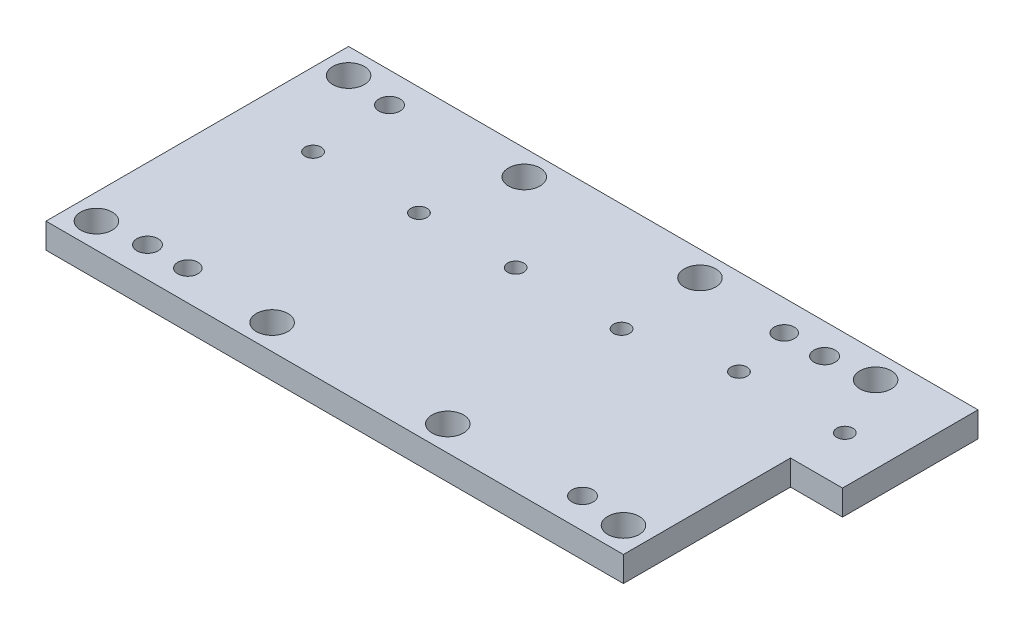
ISO-10303-21;
HEADER;
FILE_DESCRIPTION(('STEP AP214'),'2;1');
FILE_NAME('part.step','',(''),(''),'','','');
FILE_SCHEMA(('AUTOMOTIVE_DESIGN { 1 0 10303 214 1 1 1 1 }'));
ENDSEC;
DATA;
#1=APPLICATION_CONTEXT('core data for automotive mechanical design processes');
#2=APPLICATION_PROTOCOL_DEFINITION('international standard','automotive_design',2000,#1);
#3=PRODUCT_CONTEXT('',#1,'mechanical');
#4=PRODUCT('Part','Part','',(#3));
#5=PRODUCT_RELATED_PRODUCT_CATEGORY('part','',(#4));
#6=PRODUCT_DEFINITION_FORMATION('','',#4);
#7=PRODUCT_DEFINITION_CONTEXT('part definition',#1,'design');
#8=PRODUCT_DEFINITION('design','',#6,#7);
#9=PRODUCT_DEFINITION_SHAPE('','',#8);
#10=(LENGTH_UNIT() NAMED_UNIT(*) SI_UNIT(.MILLI.,.METRE.));
#11=(NAMED_UNIT(*) PLANE_ANGLE_UNIT() SI_UNIT($,.RADIAN.));
#12=(NAMED_UNIT(*) SI_UNIT($,.STERADIAN.) SOLID_ANGLE_UNIT());
#13=UNCERTAINTY_MEASURE_WITH_UNIT(LENGTH_MEASURE(1.E-05),#10,'distance_accuracy_value','');
#14=(GEOMETRIC_REPRESENTATION_CONTEXT(3) GLOBAL_UNCERTAINTY_ASSIGNED_CONTEXT((#13)) GLOBAL_UNIT_ASSIGNED_CONTEXT((#10,
#11,#12)) REPRESENTATION_CONTEXT('',''));
#15=CARTESIAN_POINT('',(0.,0.,0.));
#16=DIRECTION('',(0.,0.,1.));
#17=DIRECTION('',(1.,0.,0.));
#18=AXIS2_PLACEMENT_3D('',#15,#16,#17);
#19=CARTESIAN_POINT('',(0.,-10.,60.));
#20=DIRECTION('',(1.,0.,0.));
#21=DIRECTION('',(0.,0.,-1.));
#22=AXIS2_PLACEMENT_3D('',#19,#20,#21);
#23=PLANE('',#22);
#24=DIRECTION('',(0.,0.,-1.));
#25=VECTOR('',#24,1.);
#26=CARTESIAN_POINT('',(0.,-10.,60.));
#27=LINE('',#26,#25);
#28=CARTESIAN_POINT('',(0.,-10.,60.));
#29=VERTEX_POINT('',#28);
#30=CARTESIAN_POINT('',(0.,-10.,-6.2699959967968));
#31=VERTEX_POINT('',#30);
#32=EDGE_CURVE('E126',#29,#31,#27,.T.);
#33=ORIENTED_EDGE('',*,*,#32,.T.);
#34=DIRECTION('',(0.,1.,0.));
#35=VECTOR('',#34,1.);
#36=CARTESIAN_POINT('',(0.,-67.5553082723772,-6.2699959967968));
#37=LINE('',#36,#35);
#38=CARTESIAN_POINT('',(0.,0.,-6.2699959967968));
#39=VERTEX_POINT('',#38);
#40=EDGE_CURVE('E118',#31,#39,#37,.T.);
#41=ORIENTED_EDGE('',*,*,#40,.T.);
#42=DIRECTION('',(0.,0.,-1.));
#43=VECTOR('',#42,1.);
#44=CARTESIAN_POINT('',(0.,0.,60.));
#45=LINE('',#44,#43);
#46=CARTESIAN_POINT('',(0.,0.,60.));
#47=VERTEX_POINT('',#46);
#48=EDGE_CURVE('E125',#47,#39,#45,.T.);
#49=ORIENTED_EDGE('',*,*,#48,.F.);
#50=DIRECTION('',(0.,1.,0.));
#51=VECTOR('',#50,1.);
#52=CARTESIAN_POINT('',(0.,-10.,60.));
#53=LINE('',#52,#51);
#54=EDGE_CURVE('E11',#29,#47,#53,.T.);
#55=ORIENTED_EDGE('',*,*,#54,.F.);
#56=EDGE_LOOP('',(#33,#41,#49,#55));
#57=FACE_BOUND('',#56,.T.);
#58=ADVANCED_FACE('F39',(#57),#23,.T.);
#59=CARTESIAN_POINT('',(-229.,-10.,60.));
#60=DIRECTION('',(0.,0.,1.));
#61=DIRECTION('',(1.,0.,0.));
#62=AXIS2_PLACEMENT_3D('',#59,#60,#61);
#63=PLANE('',#62);
#64=DIRECTION('',(1.,0.,0.));
#65=VECTOR('',#64,1.);
#66=CARTESIAN_POINT('',(-229.,0.,60.));
#67=LINE('',#66,#65);
#68=CARTESIAN_POINT('',(-229.,0.,60.));
#69=VERTEX_POINT('',#68);
#70=EDGE_CURVE('E128',#69,#47,#67,.T.);
#71=ORIENTED_EDGE('',*,*,#70,.F.);
#72=DIRECTION('',(0.,1.,0.));
#73=VECTOR('',#72,1.);
#74=CARTESIAN_POINT('',(-229.,-10.,60.));
#75=LINE('',#74,#73);
#76=CARTESIAN_POINT('',(-229.,-10.,60.));
#77=VERTEX_POINT('',#76);
#78=EDGE_CURVE('E47',#77,#69,#75,.T.);
#79=ORIENTED_EDGE('',*,*,#78,.F.);
#80=DIRECTION('',(1.,0.,0.));
#81=VECTOR('',#80,1.);
#82=CARTESIAN_POINT('',(-229.,-10.,60.));
#83=LINE('',#82,#81);
#84=EDGE_CURVE('E132',#77,#29,#83,.T.);
#85=ORIENTED_EDGE('',*,*,#84,.T.);
#86=ORIENTED_EDGE('',*,*,#54,.T.);
#87=EDGE_LOOP('',(#71,#79,#85,#86));
#88=FACE_BOUND('',#87,.T.);
#89=ADVANCED_FACE('F329',(#88),#63,.T.);
#90=CARTESIAN_POINT('',(-229.,-10.,60.));
#91=DIRECTION('',(-1.,0.,0.));
#92=DIRECTION('',(0.,0.,1.));
#93=AXIS2_PLACEMENT_3D('',#90,#91,#92);
#94=PLANE('',#93);
#95=DIRECTION('',(0.,0.,1.));
#96=VECTOR('',#95,1.);
#97=CARTESIAN_POINT('',(-229.,0.,60.));
#98=LINE('',#97,#96);
#99=CARTESIAN_POINT('',(-229.,0.,-59.9999999999999));
#100=VERTEX_POINT('',#99);
#101=EDGE_CURVE('E139',#100,#69,#98,.T.);
#102=ORIENTED_EDGE('',*,*,#101,.F.);
#103=DIRECTION('',(0.,1.,0.));
#104=VECTOR('',#103,1.);
#105=CARTESIAN_POINT('',(-229.,-10.,-59.9999999999999));
#106=LINE('',#105,#104);
#107=CARTESIAN_POINT('',(-229.,-10.,-59.9999999999999));
#108=VERTEX_POINT('',#107);
#109=EDGE_CURVE('E42',#108,#100,#106,.T.);
#110=ORIENTED_EDGE('',*,*,#109,.F.);
#111=DIRECTION('',(0.,0.,1.));
#112=VECTOR('',#111,1.);
#113=CARTESIAN_POINT('',(-229.,-10.,60.));
#114=LINE('',#113,#112);
#115=EDGE_CURVE('E130',#108,#77,#114,.T.);
#116=ORIENTED_EDGE('',*,*,#115,.T.);
#117=ORIENTED_EDGE('',*,*,#78,.T.);
#118=EDGE_LOOP('',(#102,#110,#116,#117));
#119=FACE_BOUND('',#118,.T.);
#120=ADVANCED_FACE('F145',(#119),#94,.T.);
#121=CARTESIAN_POINT('',(-229.,-10.,-59.9999999999999));
#122=DIRECTION('',(0.,0.,-1.));
#123=DIRECTION('',(-1.,0.,0.));
#124=AXIS2_PLACEMENT_3D('',#121,#122,#123);
#125=PLANE('',#124);
#126=DIRECTION('',(-1.,0.,0.));
#127=VECTOR('',#126,1.);
#128=CARTESIAN_POINT('',(-229.,0.,-59.9999999999999));
#129=LINE('',#128,#127);
#130=CARTESIAN_POINT('',(20.6325030024023,0.,-60.));
#131=VERTEX_POINT('',#130);
#132=EDGE_CURVE('E136',#131,#100,#129,.T.);
#133=ORIENTED_EDGE('',*,*,#132,.F.);
#134=DIRECTION('',(0.,1.,0.));
#135=VECTOR('',#134,1.);
#136=CARTESIAN_POINT('',(20.6325030024023,-67.5553082723772,-60.));
#137=LINE('',#136,#135);
#138=CARTESIAN_POINT('',(20.6325030024023,-10.,-60.));
#139=VERTEX_POINT('',#138);
#140=EDGE_CURVE('E109',#139,#131,#137,.T.);
#141=ORIENTED_EDGE('',*,*,#140,.F.);
#142=DIRECTION('',(-1.,0.,0.));
#143=VECTOR('',#142,1.);
#144=CARTESIAN_POINT('',(-229.,-10.,-59.9999999999999));
#145=LINE('',#144,#143);
#146=EDGE_CURVE('E105',#139,#108,#145,.T.);
#147=ORIENTED_EDGE('',*,*,#146,.T.);
#148=ORIENTED_EDGE('',*,*,#109,.T.);
#149=EDGE_LOOP('',(#133,#141,#147,#148));
#150=FACE_BOUND('',#149,.T.);
#151=ADVANCED_FACE('F144',(#150),#125,.T.);
#152=CARTESIAN_POINT('',(0.,-10.,0.));
#153=DIRECTION('',(0.,-1.,0.));
#154=DIRECTION('',(0.,0.,-1.));
#155=AXIS2_PLACEMENT_3D('',#152,#153,#154);
#156=PLANE('',#155);
#157=CARTESIAN_POINT('',(-28.219,-10.,-48.));
#158=DIRECTION('',(0.,-1.,0.));
#159=DIRECTION('',(0.,0.,-1.));
#160=AXIS2_PLACEMENT_3D('',#157,#158,#159);
#161=CIRCLE('',#160,4.2);
#162=CARTESIAN_POINT('',(-28.219,-10.,-52.2));
#163=VERTEX_POINT('',#162);
#164=EDGE_CURVE('E268',#163,#163,#161,.T.);
#165=ORIENTED_EDGE('',*,*,#164,.F.);
#166=EDGE_LOOP('',(#165));
#167=FACE_BOUND('',#166,.T.);
#168=CARTESIAN_POINT('',(-200.75,-10.,-48.));
#169=DIRECTION('',(0.,-1.,0.));
#170=DIRECTION('',(0.,0.,-1.));
#171=AXIS2_PLACEMENT_3D('',#168,#169,#170);
#172=CIRCLE('',#171,4.20000000000001);
#173=CARTESIAN_POINT('',(-200.75,-10.,-52.2));
#174=VERTEX_POINT('',#173);
#175=EDGE_CURVE('E262',#174,#174,#172,.T.);
#176=ORIENTED_EDGE('',*,*,#175,.F.);
#177=EDGE_LOOP('',(#176));
#178=FACE_BOUND('',#177,.T.);
#179=CARTESIAN_POINT('',(-200.75,-10.,48.));
#180=DIRECTION('',(0.,-1.,0.));
#181=DIRECTION('',(0.,0.,-1.));
#182=AXIS2_PLACEMENT_3D('',#179,#180,#181);
#183=CIRCLE('',#182,4.20000000000001);
#184=CARTESIAN_POINT('',(-200.75,-10.,43.8));
#185=VERTEX_POINT('',#184);
#186=EDGE_CURVE('E256',#185,#185,#183,.T.);
#187=ORIENTED_EDGE('',*,*,#186,.F.);
#188=EDGE_LOOP('',(#187));
#189=FACE_BOUND('',#188,.T.);
#190=CARTESIAN_POINT('',(-28.219,-10.,48.));
#191=DIRECTION('',(0.,-1.,0.));
#192=DIRECTION('',(0.,0.,-1.));
#193=AXIS2_PLACEMENT_3D('',#190,#191,#192);
#194=CIRCLE('',#193,4.2);
#195=CARTESIAN_POINT('',(-28.219,-10.,43.8));
#196=VERTEX_POINT('',#195);
#197=EDGE_CURVE('E250',#196,#196,#194,.T.);
#198=ORIENTED_EDGE('',*,*,#197,.F.);
#199=EDGE_LOOP('',(#198));
#200=FACE_BOUND('',#199,.T.);
#201=CARTESIAN_POINT('',(-184.75,-10.,48.));
#202=DIRECTION('',(0.,-1.,0.));
#203=DIRECTION('',(0.,0.,-1.));
#204=AXIS2_PLACEMENT_3D('',#201,#202,#203);
#205=CIRCLE('',#204,3.99999999999998);
#206=CARTESIAN_POINT('',(-184.75,-10.,44.));
#207=VERTEX_POINT('',#206);
#208=EDGE_CURVE('E244',#207,#207,#205,.T.);
#209=ORIENTED_EDGE('',*,*,#208,.F.);
#210=EDGE_LOOP('',(#209));
#211=FACE_BOUND('',#210,.T.);
#212=CARTESIAN_POINT('',(-44.219,-10.,-48.));
#213=DIRECTION('',(0.,-1.,0.));
#214=DIRECTION('',(0.,0.,-1.));
#215=AXIS2_PLACEMENT_3D('',#212,#213,#214);
#216=CIRCLE('',#215,3.99999999999999);
#217=CARTESIAN_POINT('',(-44.219,-10.,-52.));
#218=VERTEX_POINT('',#217);
#219=EDGE_CURVE('E238',#218,#218,#216,.T.);
#220=ORIENTED_EDGE('',*,*,#219,.F.);
#221=EDGE_LOOP('',(#220));
#222=FACE_BOUND('',#221,.T.);
#223=CARTESIAN_POINT('',(2.12500000000002,-10.,-25.6910003850377));
#224=DIRECTION('',(0.,-1.,0.));
#225=DIRECTION('',(0.,0.,-1.));
#226=AXIS2_PLACEMENT_3D('',#223,#224,#225);
#227=CIRCLE('',#226,3.2);
#228=CARTESIAN_POINT('',(2.12500000000002,-10.,-28.8910003850377));
#229=VERTEX_POINT('',#228);
#230=EDGE_CURVE('E232',#229,#229,#227,.T.);
#231=ORIENTED_EDGE('',*,*,#230,.F.);
#232=EDGE_LOOP('',(#231));
#233=FACE_BOUND('',#232,.T.);
#234=CARTESIAN_POINT('',(-39.875,-10.,-25.6910003850377));
#235=DIRECTION('',(0.,-1.,0.));
#236=DIRECTION('',(0.,0.,-1.));
#237=AXIS2_PLACEMENT_3D('',#234,#235,#236);
#238=CIRCLE('',#237,3.2);
#239=CARTESIAN_POINT('',(-39.875,-10.,-28.8910003850377));
#240=VERTEX_POINT('',#239);
#241=EDGE_CURVE('E226',#240,#240,#238,.T.);
#242=ORIENTED_EDGE('',*,*,#241,.F.);
#243=EDGE_LOOP('',(#242));
#244=FACE_BOUND('',#243,.T.);
#245=CARTESIAN_POINT('',(-77.875,-10.,-17.1523660830142));
#246=DIRECTION('',(0.,-1.,0.));
#247=DIRECTION('',(0.,0.,-1.));
#248=AXIS2_PLACEMENT_3D('',#245,#246,#247);
#249=CIRCLE('',#248,3.19999999999999);
#250=CARTESIAN_POINT('',(-77.875,-10.,-20.3523660830141));
#251=VERTEX_POINT('',#250);
#252=EDGE_CURVE('E220',#251,#251,#249,.T.);
#253=ORIENTED_EDGE('',*,*,#252,.F.);
#254=EDGE_LOOP('',(#253));
#255=FACE_BOUND('',#254,.T.);
#256=CARTESIAN_POINT('',(-119.875,-10.,-17.1523660830142));
#257=DIRECTION('',(0.,-1.,0.));
#258=DIRECTION('',(0.,0.,-1.));
#259=AXIS2_PLACEMENT_3D('',#256,#257,#258);
#260=CIRCLE('',#259,3.19999999999999);
#261=CARTESIAN_POINT('',(-119.875,-10.,-20.3523660830142));
#262=VERTEX_POINT('',#261);
#263=EDGE_CURVE('E214',#262,#262,#260,.T.);
#264=ORIENTED_EDGE('',*,*,#263,.F.);
#265=EDGE_LOOP('',(#264));
#266=FACE_BOUND('',#265,.T.);
#267=CARTESIAN_POINT('',(-157.875,-10.,-16.78));
#268=DIRECTION('',(0.,-1.,0.));
#269=DIRECTION('',(0.,0.,-1.));
#270=AXIS2_PLACEMENT_3D('',#267,#268,#269);
#271=CIRCLE('',#270,3.20000000000001);
#272=CARTESIAN_POINT('',(-157.875,-10.,-19.98));
#273=VERTEX_POINT('',#272);
#274=EDGE_CURVE('E208',#273,#273,#271,.T.);
#275=ORIENTED_EDGE('',*,*,#274,.F.);
#276=EDGE_LOOP('',(#275));
#277=FACE_BOUND('',#276,.T.);
#278=CARTESIAN_POINT('',(-199.875,-10.,-16.78));
#279=DIRECTION('',(0.,-1.,0.));
#280=DIRECTION('',(0.,0.,-1.));
#281=AXIS2_PLACEMENT_3D('',#278,#279,#280);
#282=CIRCLE('',#281,3.20000000000001);
#283=CARTESIAN_POINT('',(-199.875,-10.,-19.98));
#284=VERTEX_POINT('',#283);
#285=EDGE_CURVE('E202',#284,#284,#282,.T.);
#286=ORIENTED_EDGE('',*,*,#285,.F.);
#287=EDGE_LOOP('',(#286));
#288=FACE_BOUND('',#287,.T.);
#289=CARTESIAN_POINT('',(-9.96899999999998,-10.,-50.));
#290=DIRECTION('',(0.,-1.,0.));
#291=DIRECTION('',(0.,0.,-1.));
#292=AXIS2_PLACEMENT_3D('',#289,#290,#291);
#293=CIRCLE('',#292,6.25);
#294=CARTESIAN_POINT('',(-9.96899999999998,-10.,-56.25));
#295=VERTEX_POINT('',#294);
#296=EDGE_CURVE('E196',#295,#295,#293,.T.);
#297=ORIENTED_EDGE('',*,*,#296,.F.);
#298=EDGE_LOOP('',(#297));
#299=FACE_BOUND('',#298,.T.);
#300=CARTESIAN_POINT('',(-79.8120139250372,-10.,-50.1837686791181));
#301=DIRECTION('',(0.,-1.,0.));
#302=DIRECTION('',(0.,0.,-1.));
#303=AXIS2_PLACEMENT_3D('',#300,#301,#302);
#304=CIRCLE('',#303,6.24999999999999);
#305=CARTESIAN_POINT('',(-79.8120139250372,-10.,-56.4337686791181));
#306=VERTEX_POINT('',#305);
#307=EDGE_CURVE('E190',#306,#306,#304,.T.);
#308=ORIENTED_EDGE('',*,*,#307,.F.);
#309=EDGE_LOOP('',(#308));
#310=FACE_BOUND('',#309,.T.);
#311=CARTESIAN_POINT('',(-149.323,-10.,-50.));
#312=DIRECTION('',(0.,-1.,0.));
#313=DIRECTION('',(0.,0.,-1.));
#314=AXIS2_PLACEMENT_3D('',#311,#312,#313);
#315=CIRCLE('',#314,6.25000000000001);
#316=CARTESIAN_POINT('',(-149.323,-10.,-56.25));
#317=VERTEX_POINT('',#316);
#318=EDGE_CURVE('E184',#317,#317,#315,.T.);
#319=ORIENTED_EDGE('',*,*,#318,.F.);
#320=EDGE_LOOP('',(#319));
#321=FACE_BOUND('',#320,.T.);
#322=CARTESIAN_POINT('',(-219.,-10.,-50.));
#323=DIRECTION('',(0.,-1.,0.));
#324=DIRECTION('',(0.,0.,-1.));
#325=AXIS2_PLACEMENT_3D('',#322,#323,#324);
#326=CIRCLE('',#325,6.25000000000001);
#327=CARTESIAN_POINT('',(-219.,-10.,-56.25));
#328=VERTEX_POINT('',#327);
#329=EDGE_CURVE('E178',#328,#328,#326,.T.);
#330=ORIENTED_EDGE('',*,*,#329,.F.);
#331=EDGE_LOOP('',(#330));
#332=FACE_BOUND('',#331,.T.);
#333=CARTESIAN_POINT('',(-219.,-10.,50.));
#334=DIRECTION('',(0.,-1.,0.));
#335=DIRECTION('',(0.,0.,-1.));
#336=AXIS2_PLACEMENT_3D('',#333,#334,#335);
#337=CIRCLE('',#336,6.25000000000001);
#338=CARTESIAN_POINT('',(-219.,-10.,43.75));
#339=VERTEX_POINT('',#338);
#340=EDGE_CURVE('E172',#339,#339,#337,.T.);
#341=ORIENTED_EDGE('',*,*,#340,.F.);
#342=EDGE_LOOP('',(#341));
#343=FACE_BOUND('',#342,.T.);
#344=CARTESIAN_POINT('',(-149.323,-10.,50.));
#345=DIRECTION('',(0.,-1.,0.));
#346=DIRECTION('',(0.,0.,-1.));
#347=AXIS2_PLACEMENT_3D('',#344,#345,#346);
#348=CIRCLE('',#347,6.25000000000001);
#349=CARTESIAN_POINT('',(-149.323,-10.,43.75));
#350=VERTEX_POINT('',#349);
#351=EDGE_CURVE('E166',#350,#350,#348,.T.);
#352=ORIENTED_EDGE('',*,*,#351,.F.);
#353=EDGE_LOOP('',(#352));
#354=FACE_BOUND('',#353,.T.);
#355=CARTESIAN_POINT('',(-79.646,-10.,50.));
#356=DIRECTION('',(0.,-1.,0.));
#357=DIRECTION('',(0.,0.,-1.));
#358=AXIS2_PLACEMENT_3D('',#355,#356,#357);
#359=CIRCLE('',#358,6.24999999999999);
#360=CARTESIAN_POINT('',(-79.646,-10.,43.75));
#361=VERTEX_POINT('',#360);
#362=EDGE_CURVE('E160',#361,#361,#359,.T.);
#363=ORIENTED_EDGE('',*,*,#362,.F.);
#364=EDGE_LOOP('',(#363));
#365=FACE_BOUND('',#364,.T.);
#366=CARTESIAN_POINT('',(-9.96899999999998,-10.,50.));
#367=DIRECTION('',(0.,-1.,0.));
#368=DIRECTION('',(0.,0.,-1.));
#369=AXIS2_PLACEMENT_3D('',#366,#367,#368);
#370=CIRCLE('',#369,6.25);
#371=CARTESIAN_POINT('',(-9.96899999999998,-10.,43.75));
#372=VERTEX_POINT('',#371);
#373=EDGE_CURVE('E150',#372,#372,#370,.T.);
#374=ORIENTED_EDGE('',*,*,#373,.F.);
#375=EDGE_LOOP('',(#374));
#376=FACE_BOUND('',#375,.T.);
#377=ORIENTED_EDGE('',*,*,#32,.F.);
#378=ORIENTED_EDGE('',*,*,#84,.F.);
#379=ORIENTED_EDGE('',*,*,#115,.F.);
#380=ORIENTED_EDGE('',*,*,#146,.F.);
#381=DIRECTION('',(0.,0.,-1.));
#382=VECTOR('',#381,1.);
#383=CARTESIAN_POINT('',(20.6325030024023,-10.,-60.));
#384=LINE('',#383,#382);
#385=CARTESIAN_POINT('',(20.6325030024023,-10.,-6.2699959967968));
#386=VERTEX_POINT('',#385);
#387=EDGE_CURVE('E99',#386,#139,#384,.T.);
#388=ORIENTED_EDGE('',*,*,#387,.F.);
#389=DIRECTION('',(1.,0.,0.));
#390=VECTOR('',#389,1.);
#391=CARTESIAN_POINT('',(0.,-10.,-6.2699959967968));
#392=LINE('',#391,#390);
#393=EDGE_CURVE('E103',#31,#386,#392,.T.);
#394=ORIENTED_EDGE('',*,*,#393,.F.);
#395=EDGE_LOOP('',(#377,#378,#379,#380,#388,#394));
#396=FACE_BOUND('',#395,.T.);
#397=ADVANCED_FACE('F101',(#167,#178,#189,#200,#211,#222,#233,#244,#255,#266,#277,#288,#299,
#310,#321,#332,#343,#354,#365,#376,#396),#156,.T.);
#398=CARTESIAN_POINT('',(0.,0.,0.));
#399=DIRECTION('',(0.,-1.,0.));
#400=DIRECTION('',(0.,0.,-1.));
#401=AXIS2_PLACEMENT_3D('',#398,#399,#400);
#402=PLANE('',#401);
#403=CARTESIAN_POINT('',(-28.219,0.,-48.));
#404=DIRECTION('',(0.,-1.,0.));
#405=DIRECTION('',(0.,0.,-1.));
#406=AXIS2_PLACEMENT_3D('',#403,#404,#405);
#407=CIRCLE('',#406,4.2);
#408=CARTESIAN_POINT('',(-28.219,0.,-52.2));
#409=VERTEX_POINT('',#408);
#410=EDGE_CURVE('E265',#409,#409,#407,.T.);
#411=ORIENTED_EDGE('',*,*,#410,.T.);
#412=EDGE_LOOP('',(#411));
#413=FACE_BOUND('',#412,.T.);
#414=CARTESIAN_POINT('',(-200.75,0.,-48.));
#415=DIRECTION('',(0.,-1.,0.));
#416=DIRECTION('',(0.,0.,-1.));
#417=AXIS2_PLACEMENT_3D('',#414,#415,#416);
#418=CIRCLE('',#417,4.20000000000001);
#419=CARTESIAN_POINT('',(-200.75,0.,-52.2));
#420=VERTEX_POINT('',#419);
#421=EDGE_CURVE('E259',#420,#420,#418,.T.);
#422=ORIENTED_EDGE('',*,*,#421,.T.);
#423=EDGE_LOOP('',(#422));
#424=FACE_BOUND('',#423,.T.);
#425=CARTESIAN_POINT('',(-200.75,0.,48.));
#426=DIRECTION('',(0.,-1.,0.));
#427=DIRECTION('',(0.,0.,-1.));
#428=AXIS2_PLACEMENT_3D('',#425,#426,#427);
#429=CIRCLE('',#428,4.20000000000001);
#430=CARTESIAN_POINT('',(-200.75,0.,43.8));
#431=VERTEX_POINT('',#430);
#432=EDGE_CURVE('E253',#431,#431,#429,.T.);
#433=ORIENTED_EDGE('',*,*,#432,.T.);
#434=EDGE_LOOP('',(#433));
#435=FACE_BOUND('',#434,.T.);
#436=CARTESIAN_POINT('',(-28.219,0.,48.));
#437=DIRECTION('',(0.,-1.,0.));
#438=DIRECTION('',(0.,0.,-1.));
#439=AXIS2_PLACEMENT_3D('',#436,#437,#438);
#440=CIRCLE('',#439,4.2);
#441=CARTESIAN_POINT('',(-28.219,0.,43.8));
#442=VERTEX_POINT('',#441);
#443=EDGE_CURVE('E247',#442,#442,#440,.T.);
#444=ORIENTED_EDGE('',*,*,#443,.T.);
#445=EDGE_LOOP('',(#444));
#446=FACE_BOUND('',#445,.T.);
#447=CARTESIAN_POINT('',(-184.75,0.,48.));
#448=DIRECTION('',(0.,-1.,0.));
#449=DIRECTION('',(0.,0.,-1.));
#450=AXIS2_PLACEMENT_3D('',#447,#448,#449);
#451=CIRCLE('',#450,4.);
#452=CARTESIAN_POINT('',(-184.75,0.,44.));
#453=VERTEX_POINT('',#452);
#454=EDGE_CURVE('E241',#453,#453,#451,.T.);
#455=ORIENTED_EDGE('',*,*,#454,.T.);
#456=EDGE_LOOP('',(#455));
#457=FACE_BOUND('',#456,.T.);
#458=CARTESIAN_POINT('',(-44.219,0.,-48.));
#459=DIRECTION('',(0.,-1.,0.));
#460=DIRECTION('',(0.,0.,-1.));
#461=AXIS2_PLACEMENT_3D('',#458,#459,#460);
#462=CIRCLE('',#461,4.);
#463=CARTESIAN_POINT('',(-44.219,0.,-52.));
#464=VERTEX_POINT('',#463);
#465=EDGE_CURVE('E235',#464,#464,#462,.T.);
#466=ORIENTED_EDGE('',*,*,#465,.T.);
#467=EDGE_LOOP('',(#466));
#468=FACE_BOUND('',#467,.T.);
#469=CARTESIAN_POINT('',(2.12500000000002,0.,-25.6910003850377));
#470=DIRECTION('',(0.,-1.,0.));
#471=DIRECTION('',(0.,0.,-1.));
#472=AXIS2_PLACEMENT_3D('',#469,#470,#471);
#473=CIRCLE('',#472,3.2);
#474=CARTESIAN_POINT('',(2.12500000000002,0.,-28.8910003850377));
#475=VERTEX_POINT('',#474);
#476=EDGE_CURVE('E229',#475,#475,#473,.T.);
#477=ORIENTED_EDGE('',*,*,#476,.T.);
#478=EDGE_LOOP('',(#477));
#479=FACE_BOUND('',#478,.T.);
#480=CARTESIAN_POINT('',(-39.875,0.,-25.6910003850377));
#481=DIRECTION('',(0.,-1.,0.));
#482=DIRECTION('',(0.,0.,-1.));
#483=AXIS2_PLACEMENT_3D('',#480,#481,#482);
#484=CIRCLE('',#483,3.19999999999999);
#485=CARTESIAN_POINT('',(-39.875,0.,-28.8910003850377));
#486=VERTEX_POINT('',#485);
#487=EDGE_CURVE('E223',#486,#486,#484,.T.);
#488=ORIENTED_EDGE('',*,*,#487,.T.);
#489=EDGE_LOOP('',(#488));
#490=FACE_BOUND('',#489,.T.);
#491=CARTESIAN_POINT('',(-77.875,0.,-17.1523660830142));
#492=DIRECTION('',(0.,-1.,0.));
#493=DIRECTION('',(0.,0.,-1.));
#494=AXIS2_PLACEMENT_3D('',#491,#492,#493);
#495=CIRCLE('',#494,3.19999999999999);
#496=CARTESIAN_POINT('',(-77.875,0.,-20.3523660830141));
#497=VERTEX_POINT('',#496);
#498=EDGE_CURVE('E217',#497,#497,#495,.T.);
#499=ORIENTED_EDGE('',*,*,#498,.T.);
#500=EDGE_LOOP('',(#499));
#501=FACE_BOUND('',#500,.T.);
#502=CARTESIAN_POINT('',(-119.875,0.,-17.1523660830142));
#503=DIRECTION('',(0.,-1.,0.));
#504=DIRECTION('',(0.,0.,-1.));
#505=AXIS2_PLACEMENT_3D('',#502,#503,#504);
#506=CIRCLE('',#505,3.19999999999999);
#507=CARTESIAN_POINT('',(-119.875,0.,-20.3523660830142));
#508=VERTEX_POINT('',#507);
#509=EDGE_CURVE('E211',#508,#508,#506,.T.);
#510=ORIENTED_EDGE('',*,*,#509,.T.);
#511=EDGE_LOOP('',(#510));
#512=FACE_BOUND('',#511,.T.);
#513=CARTESIAN_POINT('',(-157.875,0.,-16.78));
#514=DIRECTION('',(0.,-1.,0.));
#515=DIRECTION('',(0.,0.,-1.));
#516=AXIS2_PLACEMENT_3D('',#513,#514,#515);
#517=CIRCLE('',#516,3.20000000000001);
#518=CARTESIAN_POINT('',(-157.875,0.,-19.98));
#519=VERTEX_POINT('',#518);
#520=EDGE_CURVE('E205',#519,#519,#517,.T.);
#521=ORIENTED_EDGE('',*,*,#520,.T.);
#522=EDGE_LOOP('',(#521));
#523=FACE_BOUND('',#522,.T.);
#524=CARTESIAN_POINT('',(-199.875,0.,-16.78));
#525=DIRECTION('',(0.,-1.,0.));
#526=DIRECTION('',(0.,0.,-1.));
#527=AXIS2_PLACEMENT_3D('',#524,#525,#526);
#528=CIRCLE('',#527,3.20000000000001);
#529=CARTESIAN_POINT('',(-199.875,0.,-19.98));
#530=VERTEX_POINT('',#529);
#531=EDGE_CURVE('E199',#530,#530,#528,.T.);
#532=ORIENTED_EDGE('',*,*,#531,.T.);
#533=EDGE_LOOP('',(#532));
#534=FACE_BOUND('',#533,.T.);
#535=CARTESIAN_POINT('',(-9.96899999999998,0.,-50.));
#536=DIRECTION('',(0.,-1.,0.));
#537=DIRECTION('',(0.,0.,-1.));
#538=AXIS2_PLACEMENT_3D('',#535,#536,#537);
#539=CIRCLE('',#538,6.25);
#540=CARTESIAN_POINT('',(-9.96899999999998,0.,-56.25));
#541=VERTEX_POINT('',#540);
#542=EDGE_CURVE('E193',#541,#541,#539,.T.);
#543=ORIENTED_EDGE('',*,*,#542,.T.);
#544=EDGE_LOOP('',(#543));
#545=FACE_BOUND('',#544,.T.);
#546=CARTESIAN_POINT('',(-79.8120139250372,0.,-50.1837686791181));
#547=DIRECTION('',(0.,-1.,0.));
#548=DIRECTION('',(0.,0.,-1.));
#549=AXIS2_PLACEMENT_3D('',#546,#547,#548);
#550=CIRCLE('',#549,6.24999999999999);
#551=CARTESIAN_POINT('',(-79.8120139250372,0.,-56.4337686791181));
#552=VERTEX_POINT('',#551);
#553=EDGE_CURVE('E187',#552,#552,#550,.T.);
#554=ORIENTED_EDGE('',*,*,#553,.T.);
#555=EDGE_LOOP('',(#554));
#556=FACE_BOUND('',#555,.T.);
#557=CARTESIAN_POINT('',(-149.323,0.,-50.));
#558=DIRECTION('',(0.,-1.,0.));
#559=DIRECTION('',(0.,0.,-1.));
#560=AXIS2_PLACEMENT_3D('',#557,#558,#559);
#561=CIRCLE('',#560,6.25000000000001);
#562=CARTESIAN_POINT('',(-149.323,0.,-56.25));
#563=VERTEX_POINT('',#562);
#564=EDGE_CURVE('E181',#563,#563,#561,.T.);
#565=ORIENTED_EDGE('',*,*,#564,.T.);
#566=EDGE_LOOP('',(#565));
#567=FACE_BOUND('',#566,.T.);
#568=CARTESIAN_POINT('',(-219.,0.,-50.));
#569=DIRECTION('',(0.,-1.,0.));
#570=DIRECTION('',(0.,0.,-1.));
#571=AXIS2_PLACEMENT_3D('',#568,#569,#570);
#572=CIRCLE('',#571,6.25000000000001);
#573=CARTESIAN_POINT('',(-219.,0.,-56.25));
#574=VERTEX_POINT('',#573);
#575=EDGE_CURVE('E175',#574,#574,#572,.T.);
#576=ORIENTED_EDGE('',*,*,#575,.T.);
#577=EDGE_LOOP('',(#576));
#578=FACE_BOUND('',#577,.T.);
#579=CARTESIAN_POINT('',(-219.,0.,50.));
#580=DIRECTION('',(0.,-1.,0.));
#581=DIRECTION('',(0.,0.,-1.));
#582=AXIS2_PLACEMENT_3D('',#579,#580,#581);
#583=CIRCLE('',#582,6.25000000000001);
#584=CARTESIAN_POINT('',(-219.,0.,43.75));
#585=VERTEX_POINT('',#584);
#586=EDGE_CURVE('E169',#585,#585,#583,.T.);
#587=ORIENTED_EDGE('',*,*,#586,.T.);
#588=EDGE_LOOP('',(#587));
#589=FACE_BOUND('',#588,.T.);
#590=CARTESIAN_POINT('',(-149.323,0.,50.));
#591=DIRECTION('',(0.,-1.,0.));
#592=DIRECTION('',(0.,0.,-1.));
#593=AXIS2_PLACEMENT_3D('',#590,#591,#592);
#594=CIRCLE('',#593,6.25000000000001);
#595=CARTESIAN_POINT('',(-149.323,0.,43.75));
#596=VERTEX_POINT('',#595);
#597=EDGE_CURVE('E163',#596,#596,#594,.T.);
#598=ORIENTED_EDGE('',*,*,#597,.T.);
#599=EDGE_LOOP('',(#598));
#600=FACE_BOUND('',#599,.T.);
#601=CARTESIAN_POINT('',(-79.646,0.,50.));
#602=DIRECTION('',(0.,-1.,0.));
#603=DIRECTION('',(0.,0.,-1.));
#604=AXIS2_PLACEMENT_3D('',#601,#602,#603);
#605=CIRCLE('',#604,6.24999999999999);
#606=CARTESIAN_POINT('',(-79.646,0.,43.75));
#607=VERTEX_POINT('',#606);
#608=EDGE_CURVE('E155',#607,#607,#605,.T.);
#609=ORIENTED_EDGE('',*,*,#608,.T.);
#610=EDGE_LOOP('',(#609));
#611=FACE_BOUND('',#610,.T.);
#612=CARTESIAN_POINT('',(-9.96899999999998,0.,50.));
#613=DIRECTION('',(0.,-1.,0.));
#614=DIRECTION('',(0.,0.,-1.));
#615=AXIS2_PLACEMENT_3D('',#612,#613,#614);
#616=CIRCLE('',#615,6.25);
#617=CARTESIAN_POINT('',(-9.96899999999998,0.,43.75));
#618=VERTEX_POINT('',#617);
#619=EDGE_CURVE('E148',#618,#618,#616,.T.);
#620=ORIENTED_EDGE('',*,*,#619,.T.);
#621=EDGE_LOOP('',(#620));
#622=FACE_BOUND('',#621,.T.);
#623=ORIENTED_EDGE('',*,*,#48,.T.);
#624=DIRECTION('',(1.,0.,0.));
#625=VECTOR('',#624,1.);
#626=CARTESIAN_POINT('',(0.,0.,-6.2699959967968));
#627=LINE('',#626,#625);
#628=CARTESIAN_POINT('',(20.6325030024023,0.,-6.2699959967968));
#629=VERTEX_POINT('',#628);
#630=EDGE_CURVE('E55',#39,#629,#627,.T.);
#631=ORIENTED_EDGE('',*,*,#630,.T.);
#632=DIRECTION('',(0.,0.,-1.));
#633=VECTOR('',#632,1.);
#634=CARTESIAN_POINT('',(20.6325030024023,0.,-60.));
#635=LINE('',#634,#633);
#636=EDGE_CURVE('E115',#629,#131,#635,.T.);
#637=ORIENTED_EDGE('',*,*,#636,.T.);
#638=ORIENTED_EDGE('',*,*,#132,.T.);
#639=ORIENTED_EDGE('',*,*,#101,.T.);
#640=ORIENTED_EDGE('',*,*,#70,.T.);
#641=EDGE_LOOP('',(#623,#631,#637,#638,#639,#640));
#642=FACE_BOUND('',#641,.T.);
#643=ADVANCED_FACE('F147',(#413,#424,#435,#446,#457,#468,#479,#490,#501,#512,#523,#534,#545,
#556,#567,#578,#589,#600,#611,#622,#642),#402,.F.);
#644=CARTESIAN_POINT('',(0.,-67.5553082723772,-6.2699959967968));
#645=DIRECTION('',(0.,0.,1.));
#646=DIRECTION('',(1.,0.,0.));
#647=AXIS2_PLACEMENT_3D('',#644,#645,#646);
#648=PLANE('',#647);
#649=ORIENTED_EDGE('',*,*,#40,.F.);
#650=ORIENTED_EDGE('',*,*,#393,.T.);
#651=DIRECTION('',(0.,1.,0.));
#652=VECTOR('',#651,1.);
#653=CARTESIAN_POINT('',(20.6325030024023,-67.5553082723772,-6.2699959967968));
#654=LINE('',#653,#652);
#655=EDGE_CURVE('E110',#386,#629,#654,.T.);
#656=ORIENTED_EDGE('',*,*,#655,.T.);
#657=ORIENTED_EDGE('',*,*,#630,.F.);
#658=EDGE_LOOP('',(#649,#650,#656,#657));
#659=FACE_BOUND('',#658,.T.);
#660=ADVANCED_FACE('F117',(#659),#648,.T.);
#661=CARTESIAN_POINT('',(20.6325030024023,-67.5553082723772,-60.));
#662=DIRECTION('',(1.,0.,0.));
#663=DIRECTION('',(0.,0.,-1.));
#664=AXIS2_PLACEMENT_3D('',#661,#662,#663);
#665=PLANE('',#664);
#666=ORIENTED_EDGE('',*,*,#655,.F.);
#667=ORIENTED_EDGE('',*,*,#387,.T.);
#668=ORIENTED_EDGE('',*,*,#140,.T.);
#669=ORIENTED_EDGE('',*,*,#636,.F.);
#670=EDGE_LOOP('',(#666,#667,#668,#669));
#671=FACE_BOUND('',#670,.T.);
#672=ADVANCED_FACE('F113',(#671),#665,.T.);
#673=CARTESIAN_POINT('',(-9.96899999999998,-10.,50.));
#674=DIRECTION('',(0.,-1.,0.));
#675=DIRECTION('',(0.,0.,-1.));
#676=AXIS2_PLACEMENT_3D('',#673,#674,#675);
#677=CYLINDRICAL_SURFACE('',#676,6.25);
#678=ORIENTED_EDGE('',*,*,#619,.F.);
#679=EDGE_LOOP('',(#678));
#680=FACE_BOUND('',#679,.T.);
#681=ORIENTED_EDGE('',*,*,#373,.T.);
#682=EDGE_LOOP('',(#681));
#683=FACE_BOUND('',#682,.T.);
#684=ADVANCED_FACE('F315',(#680,#683),#677,.F.);
#685=CARTESIAN_POINT('',(-79.646,-10.,50.));
#686=DIRECTION('',(0.,-1.,0.));
#687=DIRECTION('',(0.,0.,-1.));
#688=AXIS2_PLACEMENT_3D('',#685,#686,#687);
#689=CYLINDRICAL_SURFACE('',#688,6.24999999999999);
#690=ORIENTED_EDGE('',*,*,#608,.F.);
#691=EDGE_LOOP('',(#690));
#692=FACE_BOUND('',#691,.T.);
#693=ORIENTED_EDGE('',*,*,#362,.T.);
#694=EDGE_LOOP('',(#693));
#695=FACE_BOUND('',#694,.T.);
#696=ADVANCED_FACE('F317',(#692,#695),#689,.F.);
#697=CARTESIAN_POINT('',(-149.323,-10.,50.));
#698=DIRECTION('',(0.,-1.,0.));
#699=DIRECTION('',(0.,0.,-1.));
#700=AXIS2_PLACEMENT_3D('',#697,#698,#699);
#701=CYLINDRICAL_SURFACE('',#700,6.25000000000001);
#702=ORIENTED_EDGE('',*,*,#597,.F.);
#703=EDGE_LOOP('',(#702));
#704=FACE_BOUND('',#703,.T.);
#705=ORIENTED_EDGE('',*,*,#351,.T.);
#706=EDGE_LOOP('',(#705));
#707=FACE_BOUND('',#706,.T.);
#708=ADVANCED_FACE('F324',(#704,#707),#701,.F.);
#709=CARTESIAN_POINT('',(-219.,-10.,50.));
#710=DIRECTION('',(0.,-1.,0.));
#711=DIRECTION('',(0.,0.,-1.));
#712=AXIS2_PLACEMENT_3D('',#709,#710,#711);
#713=CYLINDRICAL_SURFACE('',#712,6.25000000000001);
#714=ORIENTED_EDGE('',*,*,#586,.F.);
#715=EDGE_LOOP('',(#714));
#716=FACE_BOUND('',#715,.T.);
#717=ORIENTED_EDGE('',*,*,#340,.T.);
#718=EDGE_LOOP('',(#717));
#719=FACE_BOUND('',#718,.T.);
#720=ADVANCED_FACE('F378',(#716,#719),#713,.F.);
#721=CARTESIAN_POINT('',(-219.,-10.,-50.));
#722=DIRECTION('',(0.,-1.,0.));
#723=DIRECTION('',(0.,0.,-1.));
#724=AXIS2_PLACEMENT_3D('',#721,#722,#723);
#725=CYLINDRICAL_SURFACE('',#724,6.25000000000001);
#726=ORIENTED_EDGE('',*,*,#575,.F.);
#727=EDGE_LOOP('',(#726));
#728=FACE_BOUND('',#727,.T.);
#729=ORIENTED_EDGE('',*,*,#329,.T.);
#730=EDGE_LOOP('',(#729));
#731=FACE_BOUND('',#730,.T.);
#732=ADVANCED_FACE('F388',(#728,#731),#725,.F.);
#733=CARTESIAN_POINT('',(-149.323,-10.,-50.));
#734=DIRECTION('',(0.,-1.,0.));
#735=DIRECTION('',(0.,0.,-1.));
#736=AXIS2_PLACEMENT_3D('',#733,#734,#735);
#737=CYLINDRICAL_SURFACE('',#736,6.25000000000001);
#738=ORIENTED_EDGE('',*,*,#564,.F.);
#739=EDGE_LOOP('',(#738));
#740=FACE_BOUND('',#739,.T.);
#741=ORIENTED_EDGE('',*,*,#318,.T.);
#742=EDGE_LOOP('',(#741));
#743=FACE_BOUND('',#742,.T.);
#744=ADVANCED_FACE('F398',(#740,#743),#737,.F.);
#745=CARTESIAN_POINT('',(-79.8120139250372,-10.,-50.1837686791181));
#746=DIRECTION('',(0.,-1.,0.));
#747=DIRECTION('',(0.,0.,-1.));
#748=AXIS2_PLACEMENT_3D('',#745,#746,#747);
#749=CYLINDRICAL_SURFACE('',#748,6.24999999999999);
#750=ORIENTED_EDGE('',*,*,#553,.F.);
#751=EDGE_LOOP('',(#750));
#752=FACE_BOUND('',#751,.T.);
#753=ORIENTED_EDGE('',*,*,#307,.T.);
#754=EDGE_LOOP('',(#753));
#755=FACE_BOUND('',#754,.T.);
#756=ADVANCED_FACE('F408',(#752,#755),#749,.F.);
#757=CARTESIAN_POINT('',(-9.96899999999998,-10.,-50.));
#758=DIRECTION('',(0.,-1.,0.));
#759=DIRECTION('',(0.,0.,-1.));
#760=AXIS2_PLACEMENT_3D('',#757,#758,#759);
#761=CYLINDRICAL_SURFACE('',#760,6.25);
#762=ORIENTED_EDGE('',*,*,#542,.F.);
#763=EDGE_LOOP('',(#762));
#764=FACE_BOUND('',#763,.T.);
#765=ORIENTED_EDGE('',*,*,#296,.T.);
#766=EDGE_LOOP('',(#765));
#767=FACE_BOUND('',#766,.T.);
#768=ADVANCED_FACE('F418',(#764,#767),#761,.F.);
#769=CARTESIAN_POINT('',(-199.875,-10.,-16.78));
#770=DIRECTION('',(0.,-1.,0.));
#771=DIRECTION('',(0.,0.,-1.));
#772=AXIS2_PLACEMENT_3D('',#769,#770,#771);
#773=CYLINDRICAL_SURFACE('',#772,3.20000000000001);
#774=ORIENTED_EDGE('',*,*,#531,.F.);
#775=EDGE_LOOP('',(#774));
#776=FACE_BOUND('',#775,.T.);
#777=ORIENTED_EDGE('',*,*,#285,.T.);
#778=EDGE_LOOP('',(#777));
#779=FACE_BOUND('',#778,.T.);
#780=ADVANCED_FACE('F428',(#776,#779),#773,.F.);
#781=CARTESIAN_POINT('',(-157.875,-10.,-16.78));
#782=DIRECTION('',(0.,-1.,0.));
#783=DIRECTION('',(0.,0.,-1.));
#784=AXIS2_PLACEMENT_3D('',#781,#782,#783);
#785=CYLINDRICAL_SURFACE('',#784,3.20000000000001);
#786=ORIENTED_EDGE('',*,*,#520,.F.);
#787=EDGE_LOOP('',(#786));
#788=FACE_BOUND('',#787,.T.);
#789=ORIENTED_EDGE('',*,*,#274,.T.);
#790=EDGE_LOOP('',(#789));
#791=FACE_BOUND('',#790,.T.);
#792=ADVANCED_FACE('F438',(#788,#791),#785,.F.);
#793=CARTESIAN_POINT('',(-119.875,-10.,-17.1523660830142));
#794=DIRECTION('',(0.,-1.,0.));
#795=DIRECTION('',(0.,0.,-1.));
#796=AXIS2_PLACEMENT_3D('',#793,#794,#795);
#797=CYLINDRICAL_SURFACE('',#796,3.19999999999999);
#798=ORIENTED_EDGE('',*,*,#509,.F.);
#799=EDGE_LOOP('',(#798));
#800=FACE_BOUND('',#799,.T.);
#801=ORIENTED_EDGE('',*,*,#263,.T.);
#802=EDGE_LOOP('',(#801));
#803=FACE_BOUND('',#802,.T.);
#804=ADVANCED_FACE('F448',(#800,#803),#797,.F.);
#805=CARTESIAN_POINT('',(-77.875,-10.,-17.1523660830142));
#806=DIRECTION('',(0.,-1.,0.));
#807=DIRECTION('',(0.,0.,-1.));
#808=AXIS2_PLACEMENT_3D('',#805,#806,#807);
#809=CYLINDRICAL_SURFACE('',#808,3.19999999999999);
#810=ORIENTED_EDGE('',*,*,#498,.F.);
#811=EDGE_LOOP('',(#810));
#812=FACE_BOUND('',#811,.T.);
#813=ORIENTED_EDGE('',*,*,#252,.T.);
#814=EDGE_LOOP('',(#813));
#815=FACE_BOUND('',#814,.T.);
#816=ADVANCED_FACE('F458',(#812,#815),#809,.F.);
#817=CARTESIAN_POINT('',(-39.875,-10.,-25.6910003850377));
#818=DIRECTION('',(0.,-1.,0.));
#819=DIRECTION('',(0.,0.,-1.));
#820=AXIS2_PLACEMENT_3D('',#817,#818,#819);
#821=CYLINDRICAL_SURFACE('',#820,3.2);
#822=ORIENTED_EDGE('',*,*,#487,.F.);
#823=EDGE_LOOP('',(#822));
#824=FACE_BOUND('',#823,.T.);
#825=ORIENTED_EDGE('',*,*,#241,.T.);
#826=EDGE_LOOP('',(#825));
#827=FACE_BOUND('',#826,.T.);
#828=ADVANCED_FACE('F468',(#824,#827),#821,.F.);
#829=CARTESIAN_POINT('',(2.12500000000002,-10.,-25.6910003850377));
#830=DIRECTION('',(0.,-1.,0.));
#831=DIRECTION('',(0.,0.,-1.));
#832=AXIS2_PLACEMENT_3D('',#829,#830,#831);
#833=CYLINDRICAL_SURFACE('',#832,3.2);
#834=ORIENTED_EDGE('',*,*,#476,.F.);
#835=EDGE_LOOP('',(#834));
#836=FACE_BOUND('',#835,.T.);
#837=ORIENTED_EDGE('',*,*,#230,.T.);
#838=EDGE_LOOP('',(#837));
#839=FACE_BOUND('',#838,.T.);
#840=ADVANCED_FACE('F478',(#836,#839),#833,.F.);
#841=CARTESIAN_POINT('',(-44.219,-10.,-48.));
#842=DIRECTION('',(0.,-1.,0.));
#843=DIRECTION('',(0.,0.,-1.));
#844=AXIS2_PLACEMENT_3D('',#841,#842,#843);
#845=CYLINDRICAL_SURFACE('',#844,3.99999999999999);
#846=ORIENTED_EDGE('',*,*,#465,.F.);
#847=EDGE_LOOP('',(#846));
#848=FACE_BOUND('',#847,.T.);
#849=ORIENTED_EDGE('',*,*,#219,.T.);
#850=EDGE_LOOP('',(#849));
#851=FACE_BOUND('',#850,.T.);
#852=ADVANCED_FACE('F488',(#848,#851),#845,.F.);
#853=CARTESIAN_POINT('',(-184.75,-10.,48.));
#854=DIRECTION('',(0.,-1.,0.));
#855=DIRECTION('',(0.,0.,-1.));
#856=AXIS2_PLACEMENT_3D('',#853,#854,#855);
#857=CYLINDRICAL_SURFACE('',#856,3.99999999999999);
#858=ORIENTED_EDGE('',*,*,#454,.F.);
#859=EDGE_LOOP('',(#858));
#860=FACE_BOUND('',#859,.T.);
#861=ORIENTED_EDGE('',*,*,#208,.T.);
#862=EDGE_LOOP('',(#861));
#863=FACE_BOUND('',#862,.T.);
#864=ADVANCED_FACE('F498',(#860,#863),#857,.F.);
#865=CARTESIAN_POINT('',(-28.219,-10.,48.));
#866=DIRECTION('',(0.,-1.,0.));
#867=DIRECTION('',(0.,0.,-1.));
#868=AXIS2_PLACEMENT_3D('',#865,#866,#867);
#869=CYLINDRICAL_SURFACE('',#868,4.2);
#870=ORIENTED_EDGE('',*,*,#443,.F.);
#871=EDGE_LOOP('',(#870));
#872=FACE_BOUND('',#871,.T.);
#873=ORIENTED_EDGE('',*,*,#197,.T.);
#874=EDGE_LOOP('',(#873));
#875=FACE_BOUND('',#874,.T.);
#876=ADVANCED_FACE('F508',(#872,#875),#869,.F.);
#877=CARTESIAN_POINT('',(-200.75,-10.,48.));
#878=DIRECTION('',(0.,-1.,0.));
#879=DIRECTION('',(0.,0.,-1.));
#880=AXIS2_PLACEMENT_3D('',#877,#878,#879);
#881=CYLINDRICAL_SURFACE('',#880,4.20000000000001);
#882=ORIENTED_EDGE('',*,*,#432,.F.);
#883=EDGE_LOOP('',(#882));
#884=FACE_BOUND('',#883,.T.);
#885=ORIENTED_EDGE('',*,*,#186,.T.);
#886=EDGE_LOOP('',(#885));
#887=FACE_BOUND('',#886,.T.);
#888=ADVANCED_FACE('F518',(#884,#887),#881,.F.);
#889=CARTESIAN_POINT('',(-200.75,-10.,-48.));
#890=DIRECTION('',(0.,-1.,0.));
#891=DIRECTION('',(0.,0.,-1.));
#892=AXIS2_PLACEMENT_3D('',#889,#890,#891);
#893=CYLINDRICAL_SURFACE('',#892,4.20000000000001);
#894=ORIENTED_EDGE('',*,*,#421,.F.);
#895=EDGE_LOOP('',(#894));
#896=FACE_BOUND('',#895,.T.);
#897=ORIENTED_EDGE('',*,*,#175,.T.);
#898=EDGE_LOOP('',(#897));
#899=FACE_BOUND('',#898,.T.);
#900=ADVANCED_FACE('F529',(#896,#899),#893,.F.);
#901=CARTESIAN_POINT('',(-28.219,-10.,-48.));
#902=DIRECTION('',(0.,-1.,0.));
#903=DIRECTION('',(0.,0.,-1.));
#904=AXIS2_PLACEMENT_3D('',#901,#902,#903);
#905=CYLINDRICAL_SURFACE('',#904,4.2);
#906=ORIENTED_EDGE('',*,*,#410,.F.);
#907=EDGE_LOOP('',(#906));
#908=FACE_BOUND('',#907,.T.);
#909=ORIENTED_EDGE('',*,*,#164,.T.);
#910=EDGE_LOOP('',(#909));
#911=FACE_BOUND('',#910,.T.);
#912=ADVANCED_FACE('F272',(#908,#911),#905,.F.);
#913=CLOSED_SHELL('',(#58,#89,#120,#151,#397,#643,#660,#672,#684,#696,#708,#720,#732,#744,#756,
#768,#780,#792,#804,#816,#828,#840,#852,#864,#876,#888,#900,#912));
#914=MANIFOLD_SOLID_BREP('B2',#913);
#915=ADVANCED_BREP_SHAPE_REPRESENTATION('',(#18,#914),#14);
#916=SHAPE_DEFINITION_REPRESENTATION(#9,#915);
ENDSEC;
END-ISO-10303-21;
